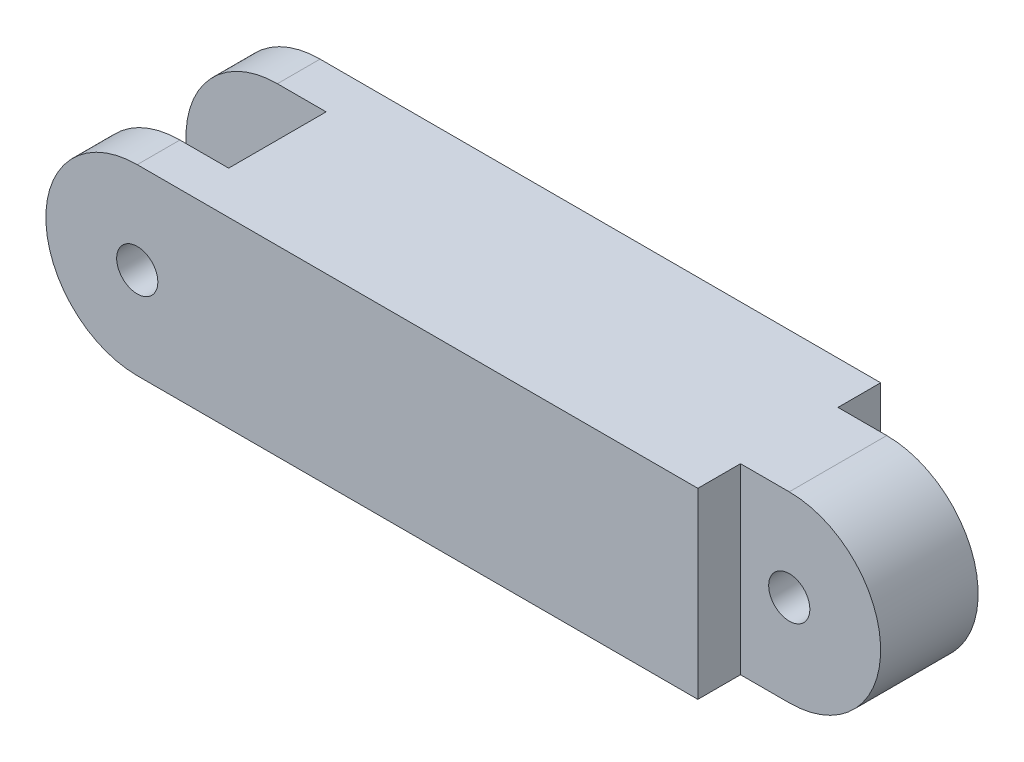
ISO-10303-21;
HEADER;
FILE_DESCRIPTION(('STEP AP214'),'2;1');
FILE_NAME('part.step','',(''),(''),'','','');
FILE_SCHEMA(('AUTOMOTIVE_DESIGN { 1 0 10303 214 1 1 1 1 }'));
ENDSEC;
DATA;
#1=APPLICATION_CONTEXT('core data for automotive mechanical design processes');
#2=APPLICATION_PROTOCOL_DEFINITION('international standard','automotive_design',2000,#1);
#3=PRODUCT_CONTEXT('',#1,'mechanical');
#4=PRODUCT('Part','Part','',(#3));
#5=PRODUCT_RELATED_PRODUCT_CATEGORY('part','',(#4));
#6=PRODUCT_DEFINITION_FORMATION('','',#4);
#7=PRODUCT_DEFINITION_CONTEXT('part definition',#1,'design');
#8=PRODUCT_DEFINITION('design','',#6,#7);
#9=PRODUCT_DEFINITION_SHAPE('','',#8);
#10=(LENGTH_UNIT() NAMED_UNIT(*) SI_UNIT(.MILLI.,.METRE.));
#11=(NAMED_UNIT(*) PLANE_ANGLE_UNIT() SI_UNIT($,.RADIAN.));
#12=(NAMED_UNIT(*) SI_UNIT($,.STERADIAN.) SOLID_ANGLE_UNIT());
#13=UNCERTAINTY_MEASURE_WITH_UNIT(LENGTH_MEASURE(1.E-05),#10,'distance_accuracy_value','');
#14=(GEOMETRIC_REPRESENTATION_CONTEXT(3) GLOBAL_UNCERTAINTY_ASSIGNED_CONTEXT((#13)) GLOBAL_UNIT_ASSIGNED_CONTEXT((#10,
#11,#12)) REPRESENTATION_CONTEXT('',''));
#15=CARTESIAN_POINT('',(0.,0.,0.));
#16=DIRECTION('',(0.,0.,1.));
#17=DIRECTION('',(1.,0.,0.));
#18=AXIS2_PLACEMENT_3D('',#15,#16,#17);
#19=CARTESIAN_POINT('',(-50.,0.,15.));
#20=DIRECTION('',(0.,0.,-1.));
#21=DIRECTION('',(-1.,0.,0.));
#22=AXIS2_PLACEMENT_3D('',#19,#20,#21);
#23=CYLINDRICAL_SURFACE('',#22,15.);
#24=DIRECTION('',(0.,0.,-1.));
#25=VECTOR('',#24,1.);
#26=CARTESIAN_POINT('',(-50.,-15.,15.));
#27=LINE('',#26,#25);
#28=CARTESIAN_POINT('',(-50.,-15.,-8.));
#29=VERTEX_POINT('',#28);
#30=CARTESIAN_POINT('',(-50.,-15.,-15.));
#31=VERTEX_POINT('',#30);
#32=EDGE_CURVE('E263',#29,#31,#27,.T.);
#33=ORIENTED_EDGE('',*,*,#32,.F.);
#34=CARTESIAN_POINT('',(-50.,0.,-8.));
#35=DIRECTION('',(0.,0.,-1.));
#36=DIRECTION('',(-1.,0.,0.));
#37=AXIS2_PLACEMENT_3D('',#34,#35,#36);
#38=CIRCLE('',#37,15.);
#39=CARTESIAN_POINT('',(-50.,15.,-8.));
#40=VERTEX_POINT('',#39);
#41=EDGE_CURVE('E205',#29,#40,#38,.T.);
#42=ORIENTED_EDGE('',*,*,#41,.T.);
#43=DIRECTION('',(0.,0.,-1.));
#44=VECTOR('',#43,1.);
#45=CARTESIAN_POINT('',(-50.,15.,15.));
#46=LINE('',#45,#44);
#47=CARTESIAN_POINT('',(-50.,15.,-15.));
#48=VERTEX_POINT('',#47);
#49=EDGE_CURVE('E240',#40,#48,#46,.T.);
#50=ORIENTED_EDGE('',*,*,#49,.T.);
#51=CARTESIAN_POINT('',(-50.,0.,-15.));
#52=DIRECTION('',(0.,0.,1.));
#53=DIRECTION('',(1.,0.,0.));
#54=AXIS2_PLACEMENT_3D('',#51,#52,#53);
#55=CIRCLE('',#54,15.);
#56=EDGE_CURVE('E227',#48,#31,#55,.T.);
#57=ORIENTED_EDGE('',*,*,#56,.T.);
#58=EDGE_LOOP('',(#33,#42,#50,#57));
#59=FACE_BOUND('',#58,.T.);
#60=ADVANCED_FACE('F39',(#59),#23,.T.);
#61=CARTESIAN_POINT('',(-50.,0.,15.));
#62=DIRECTION('',(0.,0.,1.));
#63=DIRECTION('',(1.,0.,0.));
#64=AXIS2_PLACEMENT_3D('',#61,#62,#63);
#65=CYLINDRICAL_SURFACE('',#64,3.37819999999998);
#66=CARTESIAN_POINT('',(-50.,0.,-8.));
#67=DIRECTION('',(0.,0.,-1.));
#68=DIRECTION('',(-1.,0.,0.));
#69=AXIS2_PLACEMENT_3D('',#66,#67,#68);
#70=CIRCLE('',#69,3.37819999999998);
#71=CARTESIAN_POINT('',(-53.3782,0.,-8.));
#72=VERTEX_POINT('',#71);
#73=EDGE_CURVE('E204',#72,#72,#70,.F.);
#74=ORIENTED_EDGE('',*,*,#73,.T.);
#75=EDGE_LOOP('',(#74));
#76=FACE_BOUND('',#75,.T.);
#77=CARTESIAN_POINT('',(-50.,0.,-15.));
#78=DIRECTION('',(0.,0.,1.));
#79=DIRECTION('',(1.,0.,0.));
#80=AXIS2_PLACEMENT_3D('',#77,#78,#79);
#81=CIRCLE('',#80,3.37819999999998);
#82=CARTESIAN_POINT('',(-46.6218,0.,-15.));
#83=VERTEX_POINT('',#82);
#84=EDGE_CURVE('E223',#83,#83,#81,.T.);
#85=ORIENTED_EDGE('',*,*,#84,.F.);
#86=EDGE_LOOP('',(#85));
#87=FACE_BOUND('',#86,.T.);
#88=ADVANCED_FACE('F325',(#76,#87),#65,.F.);
#89=CARTESIAN_POINT('',(-50.,15.,15.));
#90=VERTEX_POINT('',#89);
#91=CARTESIAN_POINT('',(-50.,15.,8.));
#92=VERTEX_POINT('',#91);
#93=EDGE_CURVE('E251',#90,#92,#46,.T.);
#94=ORIENTED_EDGE('',*,*,#93,.T.);
#95=CARTESIAN_POINT('',(-50.,0.,8.));
#96=DIRECTION('',(0.,0.,1.));
#97=DIRECTION('',(1.,0.,0.));
#98=AXIS2_PLACEMENT_3D('',#95,#96,#97);
#99=CIRCLE('',#98,15.);
#100=CARTESIAN_POINT('',(-50.,-15.,8.));
#101=VERTEX_POINT('',#100);
#102=EDGE_CURVE('E55',#92,#101,#99,.T.);
#103=ORIENTED_EDGE('',*,*,#102,.T.);
#104=CARTESIAN_POINT('',(-50.,-15.,15.));
#105=VERTEX_POINT('',#104);
#106=EDGE_CURVE('E151',#105,#101,#27,.T.);
#107=ORIENTED_EDGE('',*,*,#106,.F.);
#108=CARTESIAN_POINT('',(-50.,0.,15.));
#109=DIRECTION('',(0.,0.,1.));
#110=DIRECTION('',(1.,0.,0.));
#111=AXIS2_PLACEMENT_3D('',#108,#109,#110);
#112=CIRCLE('',#111,15.);
#113=EDGE_CURVE('E228',#90,#105,#112,.T.);
#114=ORIENTED_EDGE('',*,*,#113,.F.);
#115=EDGE_LOOP('',(#94,#103,#107,#114));
#116=FACE_BOUND('',#115,.T.);
#117=ADVANCED_FACE('F41',(#116),#23,.T.);
#118=CARTESIAN_POINT('',(-50.,-15.,15.));
#119=DIRECTION('',(0.,1.,0.));
#120=DIRECTION('',(-1.,0.,0.));
#121=AXIS2_PLACEMENT_3D('',#118,#119,#120);
#122=PLANE('',#121);
#123=DIRECTION('',(0.,0.,-1.));
#124=VECTOR('',#123,1.);
#125=CARTESIAN_POINT('',(-42.,-15.,-8.));
#126=LINE('',#125,#124);
#127=CARTESIAN_POINT('',(-42.,-15.,8.));
#128=VERTEX_POINT('',#127);
#129=CARTESIAN_POINT('',(-42.,-15.,-8.));
#130=VERTEX_POINT('',#129);
#131=EDGE_CURVE('E141',#128,#130,#126,.T.);
#132=ORIENTED_EDGE('',*,*,#131,.T.);
#133=DIRECTION('',(-1.,0.,0.));
#134=VECTOR('',#133,1.);
#135=CARTESIAN_POINT('',(-82.,-15.,-8.));
#136=LINE('',#135,#134);
#137=EDGE_CURVE('E138',#130,#29,#136,.T.);
#138=ORIENTED_EDGE('',*,*,#137,.T.);
#139=ORIENTED_EDGE('',*,*,#32,.T.);
#140=DIRECTION('',(1.,0.,0.));
#141=VECTOR('',#140,1.);
#142=CARTESIAN_POINT('',(-50.,-15.,-15.));
#143=LINE('',#142,#141);
#144=CARTESIAN_POINT('',(42.,-15.,-15.));
#145=VERTEX_POINT('',#144);
#146=EDGE_CURVE('E244',#31,#145,#143,.T.);
#147=ORIENTED_EDGE('',*,*,#146,.T.);
#148=DIRECTION('',(0.,0.,1.));
#149=VECTOR('',#148,1.);
#150=CARTESIAN_POINT('',(42.,-15.,-28.9161112376698));
#151=LINE('',#150,#149);
#152=CARTESIAN_POINT('',(42.,-15.,-8.));
#153=VERTEX_POINT('',#152);
#154=EDGE_CURVE('E169',#145,#153,#151,.T.);
#155=ORIENTED_EDGE('',*,*,#154,.T.);
#156=DIRECTION('',(1.,0.,0.));
#157=VECTOR('',#156,1.);
#158=CARTESIAN_POINT('',(42.,-15.,-8.));
#159=LINE('',#158,#157);
#160=CARTESIAN_POINT('',(50.,-15.,-8.));
#161=VERTEX_POINT('',#160);
#162=EDGE_CURVE('E173',#153,#161,#159,.T.);
#163=ORIENTED_EDGE('',*,*,#162,.T.);
#164=DIRECTION('',(0.,0.,-1.));
#165=VECTOR('',#164,1.);
#166=CARTESIAN_POINT('',(50.,-15.,15.));
#167=LINE('',#166,#165);
#168=CARTESIAN_POINT('',(50.,-15.,8.));
#169=VERTEX_POINT('',#168);
#170=EDGE_CURVE('E259',#169,#161,#167,.T.);
#171=ORIENTED_EDGE('',*,*,#170,.F.);
#172=DIRECTION('',(-1.,0.,0.));
#173=VECTOR('',#172,1.);
#174=CARTESIAN_POINT('',(42.,-15.,8.));
#175=LINE('',#174,#173);
#176=CARTESIAN_POINT('',(42.,-15.,8.));
#177=VERTEX_POINT('',#176);
#178=EDGE_CURVE('E191',#169,#177,#175,.T.);
#179=ORIENTED_EDGE('',*,*,#178,.T.);
#180=DIRECTION('',(0.,0.,1.));
#181=VECTOR('',#180,1.);
#182=CARTESIAN_POINT('',(42.,-15.,28.9161112376696));
#183=LINE('',#182,#181);
#184=CARTESIAN_POINT('',(42.,-15.,15.));
#185=VERTEX_POINT('',#184);
#186=EDGE_CURVE('E187',#177,#185,#183,.T.);
#187=ORIENTED_EDGE('',*,*,#186,.T.);
#188=DIRECTION('',(1.,0.,0.));
#189=VECTOR('',#188,1.);
#190=CARTESIAN_POINT('',(-50.,-15.,15.));
#191=LINE('',#190,#189);
#192=EDGE_CURVE('E232',#105,#185,#191,.T.);
#193=ORIENTED_EDGE('',*,*,#192,.F.);
#194=ORIENTED_EDGE('',*,*,#106,.T.);
#195=DIRECTION('',(1.,0.,0.));
#196=VECTOR('',#195,1.);
#197=CARTESIAN_POINT('',(-82.,-15.,8.));
#198=LINE('',#197,#196);
#199=EDGE_CURVE('E131',#101,#128,#198,.T.);
#200=ORIENTED_EDGE('',*,*,#199,.T.);
#201=EDGE_LOOP('',(#132,#138,#139,#147,#155,#163,#171,#179,#187,#193,#194,#200));
#202=FACE_BOUND('',#201,.T.);
#203=ADVANCED_FACE('F149',(#202),#122,.F.);
#204=CARTESIAN_POINT('',(50.,0.,15.));
#205=DIRECTION('',(0.,0.,-1.));
#206=DIRECTION('',(-1.,0.,0.));
#207=AXIS2_PLACEMENT_3D('',#204,#205,#206);
#208=CYLINDRICAL_SURFACE('',#207,15.);
#209=ORIENTED_EDGE('',*,*,#170,.T.);
#210=CARTESIAN_POINT('',(50.,0.,-8.));
#211=DIRECTION('',(0.,0.,1.));
#212=DIRECTION('',(1.,0.,0.));
#213=AXIS2_PLACEMENT_3D('',#210,#211,#212);
#214=CIRCLE('',#213,15.);
#215=CARTESIAN_POINT('',(50.,15.,-8.));
#216=VERTEX_POINT('',#215);
#217=EDGE_CURVE('E215',#161,#216,#214,.T.);
#218=ORIENTED_EDGE('',*,*,#217,.T.);
#219=DIRECTION('',(0.,0.,-1.));
#220=VECTOR('',#219,1.);
#221=CARTESIAN_POINT('',(50.,15.,15.));
#222=LINE('',#221,#220);
#223=CARTESIAN_POINT('',(50.,15.,8.));
#224=VERTEX_POINT('',#223);
#225=EDGE_CURVE('E255',#224,#216,#222,.T.);
#226=ORIENTED_EDGE('',*,*,#225,.F.);
#227=CARTESIAN_POINT('',(50.,0.,8.));
#228=DIRECTION('',(0.,0.,-1.));
#229=DIRECTION('',(-1.,0.,0.));
#230=AXIS2_PLACEMENT_3D('',#227,#228,#229);
#231=CIRCLE('',#230,15.);
#232=EDGE_CURVE('E210',#224,#169,#231,.T.);
#233=ORIENTED_EDGE('',*,*,#232,.T.);
#234=EDGE_LOOP('',(#209,#218,#226,#233));
#235=FACE_BOUND('',#234,.T.);
#236=ADVANCED_FACE('F301',(#235),#208,.T.);
#237=CARTESIAN_POINT('',(-50.,15.,15.));
#238=DIRECTION('',(0.,-1.,0.));
#239=DIRECTION('',(1.,0.,0.));
#240=AXIS2_PLACEMENT_3D('',#237,#238,#239);
#241=PLANE('',#240);
#242=ORIENTED_EDGE('',*,*,#49,.F.);
#243=DIRECTION('',(-1.,0.,0.));
#244=VECTOR('',#243,1.);
#245=CARTESIAN_POINT('',(-82.,15.,-8.));
#246=LINE('',#245,#244);
#247=CARTESIAN_POINT('',(-42.,15.,-8.));
#248=VERTEX_POINT('',#247);
#249=EDGE_CURVE('E153',#248,#40,#246,.T.);
#250=ORIENTED_EDGE('',*,*,#249,.F.);
#251=DIRECTION('',(0.,0.,-1.));
#252=VECTOR('',#251,1.);
#253=CARTESIAN_POINT('',(-42.,15.,-8.));
#254=LINE('',#253,#252);
#255=CARTESIAN_POINT('',(-42.,15.,8.));
#256=VERTEX_POINT('',#255);
#257=EDGE_CURVE('E156',#256,#248,#254,.T.);
#258=ORIENTED_EDGE('',*,*,#257,.F.);
#259=DIRECTION('',(1.,0.,0.));
#260=VECTOR('',#259,1.);
#261=CARTESIAN_POINT('',(-82.,15.,8.));
#262=LINE('',#261,#260);
#263=EDGE_CURVE('E132',#92,#256,#262,.T.);
#264=ORIENTED_EDGE('',*,*,#263,.F.);
#265=ORIENTED_EDGE('',*,*,#93,.F.);
#266=DIRECTION('',(-1.,0.,0.));
#267=VECTOR('',#266,1.);
#268=CARTESIAN_POINT('',(-50.,15.,15.));
#269=LINE('',#268,#267);
#270=CARTESIAN_POINT('',(42.,15.,15.));
#271=VERTEX_POINT('',#270);
#272=EDGE_CURVE('E237',#271,#90,#269,.T.);
#273=ORIENTED_EDGE('',*,*,#272,.F.);
#274=DIRECTION('',(0.,0.,1.));
#275=VECTOR('',#274,1.);
#276=CARTESIAN_POINT('',(42.,15.,28.9161112376696));
#277=LINE('',#276,#275);
#278=CARTESIAN_POINT('',(42.,15.,8.));
#279=VERTEX_POINT('',#278);
#280=EDGE_CURVE('E62',#279,#271,#277,.T.);
#281=ORIENTED_EDGE('',*,*,#280,.F.);
#282=DIRECTION('',(-1.,0.,0.));
#283=VECTOR('',#282,1.);
#284=CARTESIAN_POINT('',(42.,15.,8.));
#285=LINE('',#284,#283);
#286=EDGE_CURVE('E192',#224,#279,#285,.T.);
#287=ORIENTED_EDGE('',*,*,#286,.F.);
#288=ORIENTED_EDGE('',*,*,#225,.T.);
#289=DIRECTION('',(1.,0.,0.));
#290=VECTOR('',#289,1.);
#291=CARTESIAN_POINT('',(42.,15.,-8.));
#292=LINE('',#291,#290);
#293=CARTESIAN_POINT('',(42.,15.,-8.));
#294=VERTEX_POINT('',#293);
#295=EDGE_CURVE('E174',#294,#216,#292,.T.);
#296=ORIENTED_EDGE('',*,*,#295,.F.);
#297=DIRECTION('',(0.,0.,1.));
#298=VECTOR('',#297,1.);
#299=CARTESIAN_POINT('',(42.,15.,-28.9161112376698));
#300=LINE('',#299,#298);
#301=CARTESIAN_POINT('',(42.,15.,-15.));
#302=VERTEX_POINT('',#301);
#303=EDGE_CURVE('E178',#302,#294,#300,.T.);
#304=ORIENTED_EDGE('',*,*,#303,.F.);
#305=DIRECTION('',(-1.,0.,0.));
#306=VECTOR('',#305,1.);
#307=CARTESIAN_POINT('',(-50.,15.,-15.));
#308=LINE('',#307,#306);
#309=EDGE_CURVE('E233',#302,#48,#308,.T.);
#310=ORIENTED_EDGE('',*,*,#309,.T.);
#311=EDGE_LOOP('',(#242,#250,#258,#264,#265,#273,#281,#287,#288,#296,#304,#310));
#312=FACE_BOUND('',#311,.T.);
#313=ADVANCED_FACE('F293',(#312),#241,.F.);
#314=CARTESIAN_POINT('',(-50.,0.,15.));
#315=DIRECTION('',(0.,0.,1.));
#316=DIRECTION('',(1.,0.,0.));
#317=AXIS2_PLACEMENT_3D('',#314,#315,#316);
#318=PLANE('',#317);
#319=DIRECTION('',(0.,-1.,0.));
#320=VECTOR('',#319,1.);
#321=CARTESIAN_POINT('',(42.,0.,15.));
#322=LINE('',#321,#320);
#323=EDGE_CURVE('E11',#271,#185,#322,.T.);
#324=ORIENTED_EDGE('',*,*,#323,.F.);
#325=ORIENTED_EDGE('',*,*,#272,.T.);
#326=ORIENTED_EDGE('',*,*,#113,.T.);
#327=ORIENTED_EDGE('',*,*,#192,.T.);
#328=EDGE_LOOP('',(#324,#325,#326,#327));
#329=FACE_BOUND('',#328,.T.);
#330=CARTESIAN_POINT('',(-50.,0.,15.));
#331=DIRECTION('',(0.,0.,1.));
#332=DIRECTION('',(1.,0.,0.));
#333=AXIS2_PLACEMENT_3D('',#330,#331,#332);
#334=CIRCLE('',#333,3.37819999999998);
#335=CARTESIAN_POINT('',(-46.6218,0.,15.));
#336=VERTEX_POINT('',#335);
#337=EDGE_CURVE('E219',#336,#336,#334,.T.);
#338=ORIENTED_EDGE('',*,*,#337,.F.);
#339=EDGE_LOOP('',(#338));
#340=FACE_BOUND('',#339,.T.);
#341=ADVANCED_FACE('F310',(#329,#340),#318,.T.);
#342=CARTESIAN_POINT('',(-50.,0.,-15.));
#343=DIRECTION('',(0.,0.,1.));
#344=DIRECTION('',(1.,0.,0.));
#345=AXIS2_PLACEMENT_3D('',#342,#343,#344);
#346=PLANE('',#345);
#347=ORIENTED_EDGE('',*,*,#84,.T.);
#348=EDGE_LOOP('',(#347));
#349=FACE_BOUND('',#348,.T.);
#350=ORIENTED_EDGE('',*,*,#309,.F.);
#351=DIRECTION('',(0.,-1.,0.));
#352=VECTOR('',#351,1.);
#353=CARTESIAN_POINT('',(42.,0.,-15.));
#354=LINE('',#353,#352);
#355=EDGE_CURVE('E48',#302,#145,#354,.T.);
#356=ORIENTED_EDGE('',*,*,#355,.T.);
#357=ORIENTED_EDGE('',*,*,#146,.F.);
#358=ORIENTED_EDGE('',*,*,#56,.F.);
#359=EDGE_LOOP('',(#350,#356,#357,#358));
#360=FACE_BOUND('',#359,.T.);
#361=ADVANCED_FACE('F282',(#349,#360),#346,.F.);
#362=CARTESIAN_POINT('',(-50.,0.,8.));
#363=DIRECTION('',(0.,0.,1.));
#364=DIRECTION('',(1.,0.,0.));
#365=AXIS2_PLACEMENT_3D('',#362,#363,#364);
#366=CIRCLE('',#365,3.37819999999998);
#367=CARTESIAN_POINT('',(-46.6218,0.,8.));
#368=VERTEX_POINT('',#367);
#369=EDGE_CURVE('E167',#368,#368,#366,.F.);
#370=ORIENTED_EDGE('',*,*,#369,.T.);
#371=EDGE_LOOP('',(#370));
#372=FACE_BOUND('',#371,.T.);
#373=ORIENTED_EDGE('',*,*,#337,.T.);
#374=EDGE_LOOP('',(#373));
#375=FACE_BOUND('',#374,.T.);
#376=ADVANCED_FACE('F330',(#372,#375),#65,.F.);
#377=CARTESIAN_POINT('',(-82.,-15.,-8.));
#378=DIRECTION('',(0.,0.,-1.));
#379=DIRECTION('',(-1.,0.,0.));
#380=AXIS2_PLACEMENT_3D('',#377,#378,#379);
#381=PLANE('',#380);
#382=ORIENTED_EDGE('',*,*,#73,.F.);
#383=EDGE_LOOP('',(#382));
#384=FACE_BOUND('',#383,.T.);
#385=ORIENTED_EDGE('',*,*,#137,.F.);
#386=DIRECTION('',(0.,1.,0.));
#387=VECTOR('',#386,1.);
#388=CARTESIAN_POINT('',(-42.,-15.,-8.));
#389=LINE('',#388,#387);
#390=EDGE_CURVE('E137',#130,#248,#389,.T.);
#391=ORIENTED_EDGE('',*,*,#390,.T.);
#392=ORIENTED_EDGE('',*,*,#249,.T.);
#393=ORIENTED_EDGE('',*,*,#41,.F.);
#394=EDGE_LOOP('',(#385,#391,#392,#393));
#395=FACE_BOUND('',#394,.T.);
#396=ADVANCED_FACE('F352',(#384,#395),#381,.F.);
#397=CARTESIAN_POINT('',(-82.,-15.,8.));
#398=DIRECTION('',(0.,0.,1.));
#399=DIRECTION('',(1.,0.,0.));
#400=AXIS2_PLACEMENT_3D('',#397,#398,#399);
#401=PLANE('',#400);
#402=ORIENTED_EDGE('',*,*,#369,.F.);
#403=EDGE_LOOP('',(#402));
#404=FACE_BOUND('',#403,.T.);
#405=ORIENTED_EDGE('',*,*,#263,.T.);
#406=DIRECTION('',(0.,1.,0.));
#407=VECTOR('',#406,1.);
#408=CARTESIAN_POINT('',(-42.,-15.,8.));
#409=LINE('',#408,#407);
#410=EDGE_CURVE('E127',#128,#256,#409,.T.);
#411=ORIENTED_EDGE('',*,*,#410,.F.);
#412=ORIENTED_EDGE('',*,*,#199,.F.);
#413=ORIENTED_EDGE('',*,*,#102,.F.);
#414=EDGE_LOOP('',(#405,#411,#412,#413));
#415=FACE_BOUND('',#414,.T.);
#416=ADVANCED_FACE('F129',(#404,#415),#401,.F.);
#417=CARTESIAN_POINT('',(-42.,-15.,-8.));
#418=DIRECTION('',(1.,0.,0.));
#419=DIRECTION('',(0.,1.,0.));
#420=AXIS2_PLACEMENT_3D('',#417,#418,#419);
#421=PLANE('',#420);
#422=ORIENTED_EDGE('',*,*,#257,.T.);
#423=ORIENTED_EDGE('',*,*,#390,.F.);
#424=ORIENTED_EDGE('',*,*,#131,.F.);
#425=ORIENTED_EDGE('',*,*,#410,.T.);
#426=EDGE_LOOP('',(#422,#423,#424,#425));
#427=FACE_BOUND('',#426,.T.);
#428=ADVANCED_FACE('F142',(#427),#421,.F.);
#429=CARTESIAN_POINT('',(42.,-15.,8.));
#430=DIRECTION('',(0.,0.,-1.));
#431=DIRECTION('',(-1.,0.,0.));
#432=AXIS2_PLACEMENT_3D('',#429,#430,#431);
#433=PLANE('',#432);
#434=CARTESIAN_POINT('',(50.,0.,8.));
#435=DIRECTION('',(0.,0.,-1.));
#436=DIRECTION('',(-1.,0.,0.));
#437=AXIS2_PLACEMENT_3D('',#434,#435,#436);
#438=CIRCLE('',#437,3.37819999999998);
#439=CARTESIAN_POINT('',(46.6218,0.,8.));
#440=VERTEX_POINT('',#439);
#441=EDGE_CURVE('E209',#440,#440,#438,.F.);
#442=ORIENTED_EDGE('',*,*,#441,.F.);
#443=EDGE_LOOP('',(#442));
#444=FACE_BOUND('',#443,.T.);
#445=ORIENTED_EDGE('',*,*,#286,.T.);
#446=DIRECTION('',(0.,1.,0.));
#447=VECTOR('',#446,1.);
#448=CARTESIAN_POINT('',(42.,-15.,8.));
#449=LINE('',#448,#447);
#450=EDGE_CURVE('E181',#177,#279,#449,.T.);
#451=ORIENTED_EDGE('',*,*,#450,.F.);
#452=ORIENTED_EDGE('',*,*,#178,.F.);
#453=ORIENTED_EDGE('',*,*,#232,.F.);
#454=EDGE_LOOP('',(#445,#451,#452,#453));
#455=FACE_BOUND('',#454,.T.);
#456=ADVANCED_FACE('F305',(#444,#455),#433,.F.);
#457=CARTESIAN_POINT('',(42.,-15.,28.9161112376696));
#458=DIRECTION('',(-1.,0.,0.));
#459=DIRECTION('',(0.,0.,1.));
#460=AXIS2_PLACEMENT_3D('',#457,#458,#459);
#461=PLANE('',#460);
#462=ORIENTED_EDGE('',*,*,#323,.T.);
#463=ORIENTED_EDGE('',*,*,#186,.F.);
#464=ORIENTED_EDGE('',*,*,#450,.T.);
#465=ORIENTED_EDGE('',*,*,#280,.T.);
#466=EDGE_LOOP('',(#462,#463,#464,#465));
#467=FACE_BOUND('',#466,.T.);
#468=ADVANCED_FACE('F313',(#467),#461,.F.);
#469=CARTESIAN_POINT('',(42.,-15.,-28.9161112376698));
#470=DIRECTION('',(-1.,0.,0.));
#471=DIRECTION('',(0.,0.,1.));
#472=AXIS2_PLACEMENT_3D('',#469,#470,#471);
#473=PLANE('',#472);
#474=ORIENTED_EDGE('',*,*,#303,.T.);
#475=DIRECTION('',(0.,1.,0.));
#476=VECTOR('',#475,1.);
#477=CARTESIAN_POINT('',(42.,-15.,-8.));
#478=LINE('',#477,#476);
#479=EDGE_CURVE('E163',#153,#294,#478,.T.);
#480=ORIENTED_EDGE('',*,*,#479,.F.);
#481=ORIENTED_EDGE('',*,*,#154,.F.);
#482=ORIENTED_EDGE('',*,*,#355,.F.);
#483=EDGE_LOOP('',(#474,#480,#481,#482));
#484=FACE_BOUND('',#483,.T.);
#485=ADVANCED_FACE('F295',(#484),#473,.F.);
#486=CARTESIAN_POINT('',(42.,-15.,-8.));
#487=DIRECTION('',(0.,0.,1.));
#488=DIRECTION('',(1.,0.,0.));
#489=AXIS2_PLACEMENT_3D('',#486,#487,#488);
#490=PLANE('',#489);
#491=CARTESIAN_POINT('',(50.,0.,-8.));
#492=DIRECTION('',(0.,0.,1.));
#493=DIRECTION('',(1.,0.,0.));
#494=AXIS2_PLACEMENT_3D('',#491,#492,#493);
#495=CIRCLE('',#494,3.37819999999998);
#496=CARTESIAN_POINT('',(53.3782,0.,-8.));
#497=VERTEX_POINT('',#496);
#498=EDGE_CURVE('E214',#497,#497,#495,.F.);
#499=ORIENTED_EDGE('',*,*,#498,.F.);
#500=EDGE_LOOP('',(#499));
#501=FACE_BOUND('',#500,.T.);
#502=ORIENTED_EDGE('',*,*,#162,.F.);
#503=ORIENTED_EDGE('',*,*,#479,.T.);
#504=ORIENTED_EDGE('',*,*,#295,.T.);
#505=ORIENTED_EDGE('',*,*,#217,.F.);
#506=EDGE_LOOP('',(#502,#503,#504,#505));
#507=FACE_BOUND('',#506,.T.);
#508=ADVANCED_FACE('F298',(#501,#507),#490,.F.);
#509=CARTESIAN_POINT('',(50.,0.,15.));
#510=DIRECTION('',(0.,0.,1.));
#511=DIRECTION('',(1.,0.,0.));
#512=AXIS2_PLACEMENT_3D('',#509,#510,#511);
#513=CYLINDRICAL_SURFACE('',#512,3.37819999999998);
#514=ORIENTED_EDGE('',*,*,#498,.T.);
#515=EDGE_LOOP('',(#514));
#516=FACE_BOUND('',#515,.T.);
#517=ORIENTED_EDGE('',*,*,#441,.T.);
#518=EDGE_LOOP('',(#517));
#519=FACE_BOUND('',#518,.T.);
#520=ADVANCED_FACE('F348',(#516,#519),#513,.F.);
#521=CLOSED_SHELL('',(#60,#88,#117,#203,#236,#313,#341,#361,#376,#396,#416,#428,#456,#468,#485,
#508,#520));
#522=MANIFOLD_SOLID_BREP('B2',#521);
#523=ADVANCED_BREP_SHAPE_REPRESENTATION('',(#18,#522),#14);
#524=SHAPE_DEFINITION_REPRESENTATION(#9,#523);
ENDSEC;
END-ISO-10303-21;
